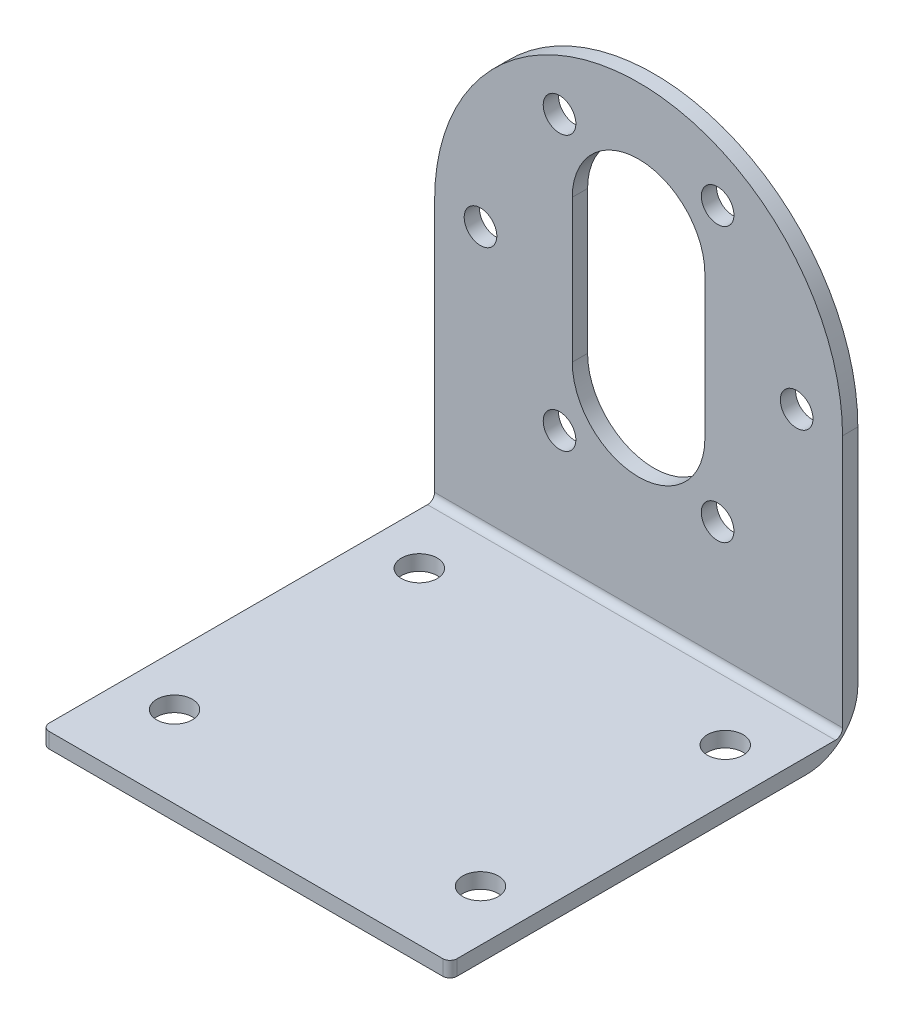
ISO-10303-21;
HEADER;
FILE_DESCRIPTION(('STEP AP214'),'2;1');
FILE_NAME('part.step','',(''),(''),'','','');
FILE_SCHEMA(('AUTOMOTIVE_DESIGN { 1 0 10303 214 1 1 1 1 }'));
ENDSEC;
DATA;
#1=APPLICATION_CONTEXT('core data for automotive mechanical design processes');
#2=APPLICATION_PROTOCOL_DEFINITION('international standard','automotive_design',2000,#1);
#3=PRODUCT_CONTEXT('',#1,'mechanical');
#4=PRODUCT('Part','Part','',(#3));
#5=PRODUCT_RELATED_PRODUCT_CATEGORY('part','',(#4));
#6=PRODUCT_DEFINITION_FORMATION('','',#4);
#7=PRODUCT_DEFINITION_CONTEXT('part definition',#1,'design');
#8=PRODUCT_DEFINITION('design','',#6,#7);
#9=PRODUCT_DEFINITION_SHAPE('','',#8);
#10=(LENGTH_UNIT() NAMED_UNIT(*) SI_UNIT(.MILLI.,.METRE.));
#11=(NAMED_UNIT(*) PLANE_ANGLE_UNIT() SI_UNIT($,.RADIAN.));
#12=(NAMED_UNIT(*) SI_UNIT($,.STERADIAN.) SOLID_ANGLE_UNIT());
#13=UNCERTAINTY_MEASURE_WITH_UNIT(LENGTH_MEASURE(1.E-05),#10,'distance_accuracy_value','');
#14=(GEOMETRIC_REPRESENTATION_CONTEXT(3) GLOBAL_UNCERTAINTY_ASSIGNED_CONTEXT((#13)) GLOBAL_UNIT_ASSIGNED_CONTEXT((#10,
#11,#12)) REPRESENTATION_CONTEXT('',''));
#15=CARTESIAN_POINT('',(0.,0.,0.));
#16=DIRECTION('',(0.,0.,1.));
#17=DIRECTION('',(1.,0.,0.));
#18=AXIS2_PLACEMENT_3D('',#15,#16,#17);
#19=CARTESIAN_POINT('',(40.,5.03672580799631,-40.));
#20=DIRECTION('',(0.,0.,1.));
#21=DIRECTION('',(1.,0.,0.));
#22=AXIS2_PLACEMENT_3D('',#19,#20,#21);
#23=PLANE('',#22);
#24=CARTESIAN_POINT('',(35.5001602165439,27.,-40.));
#25=DIRECTION('',(0.,0.,-1.));
#26=DIRECTION('',(-1.,0.,0.));
#27=AXIS2_PLACEMENT_3D('',#24,#25,#26);
#28=CIRCLE('',#27,1.6);
#29=CARTESIAN_POINT('',(33.9001602165439,27.,-40.));
#30=VERTEX_POINT('',#29);
#31=EDGE_CURVE('E188',#30,#30,#28,.T.);
#32=ORIENTED_EDGE('',*,*,#31,.F.);
#33=EDGE_LOOP('',(#32));
#34=FACE_BOUND('',#33,.T.);
#35=CARTESIAN_POINT('',(27.750080108272,13.5764674897441,-40.));
#36=DIRECTION('',(0.,0.,-1.));
#37=DIRECTION('',(-1.,0.,0.));
#38=AXIS2_PLACEMENT_3D('',#35,#36,#37);
#39=CIRCLE('',#38,1.59999999999999);
#40=CARTESIAN_POINT('',(26.150080108272,13.5764674897441,-40.));
#41=VERTEX_POINT('',#40);
#42=EDGE_CURVE('E590',#41,#41,#39,.T.);
#43=ORIENTED_EDGE('',*,*,#42,.F.);
#44=EDGE_LOOP('',(#43));
#45=FACE_BOUND('',#44,.T.);
#46=CARTESIAN_POINT('',(12.249919891728,13.5764674897441,-40.));
#47=DIRECTION('',(0.,0.,-1.));
#48=DIRECTION('',(-1.,0.,0.));
#49=AXIS2_PLACEMENT_3D('',#46,#47,#48);
#50=CIRCLE('',#49,1.6);
#51=CARTESIAN_POINT('',(10.649919891728,13.5764674897441,-40.));
#52=VERTEX_POINT('',#51);
#53=EDGE_CURVE('E594',#52,#52,#50,.T.);
#54=ORIENTED_EDGE('',*,*,#53,.F.);
#55=EDGE_LOOP('',(#54));
#56=FACE_BOUND('',#55,.T.);
#57=CARTESIAN_POINT('',(27.750080108272,40.4235325102559,-40.));
#58=DIRECTION('',(0.,0.,-1.));
#59=DIRECTION('',(-1.,0.,0.));
#60=AXIS2_PLACEMENT_3D('',#57,#58,#59);
#61=CIRCLE('',#60,1.6);
#62=CARTESIAN_POINT('',(26.150080108272,40.4235325102559,-40.));
#63=VERTEX_POINT('',#62);
#64=EDGE_CURVE('E598',#63,#63,#61,.T.);
#65=ORIENTED_EDGE('',*,*,#64,.F.);
#66=EDGE_LOOP('',(#65));
#67=FACE_BOUND('',#66,.T.);
#68=DIRECTION('',(0.,1.,0.));
#69=VECTOR('',#68,1.);
#70=CARTESIAN_POINT('',(13.5,34.,-40.));
#71=LINE('',#70,#69);
#72=CARTESIAN_POINT('',(13.5,20.,-40.));
#73=VERTEX_POINT('',#72);
#74=CARTESIAN_POINT('',(13.5,34.,-40.));
#75=VERTEX_POINT('',#74);
#76=EDGE_CURVE('E610',#73,#75,#71,.T.);
#77=ORIENTED_EDGE('',*,*,#76,.F.);
#78=CARTESIAN_POINT('',(20.,20.,-40.));
#79=DIRECTION('',(0.,0.,-1.));
#80=DIRECTION('',(1.,0.,0.));
#81=AXIS2_PLACEMENT_3D('',#78,#79,#80);
#82=CIRCLE('',#81,6.5);
#83=CARTESIAN_POINT('',(26.5,20.,-40.));
#84=VERTEX_POINT('',#83);
#85=EDGE_CURVE('E182',#84,#73,#82,.T.);
#86=ORIENTED_EDGE('',*,*,#85,.F.);
#87=DIRECTION('',(0.,-1.,0.));
#88=VECTOR('',#87,1.);
#89=CARTESIAN_POINT('',(26.5,20.,-40.));
#90=LINE('',#89,#88);
#91=CARTESIAN_POINT('',(26.5,34.,-40.));
#92=VERTEX_POINT('',#91);
#93=EDGE_CURVE('E168',#92,#84,#90,.T.);
#94=ORIENTED_EDGE('',*,*,#93,.F.);
#95=CARTESIAN_POINT('',(20.,34.,-40.));
#96=DIRECTION('',(0.,0.,-1.));
#97=DIRECTION('',(1.,0.,0.));
#98=AXIS2_PLACEMENT_3D('',#95,#96,#97);
#99=CIRCLE('',#98,6.5);
#100=EDGE_CURVE('E607',#75,#92,#99,.T.);
#101=ORIENTED_EDGE('',*,*,#100,.F.);
#102=EDGE_LOOP('',(#77,#86,#94,#101));
#103=FACE_BOUND('',#102,.T.);
#104=CARTESIAN_POINT('',(12.249919891728,40.4235325102559,-40.));
#105=DIRECTION('',(0.,0.,-1.));
#106=DIRECTION('',(-1.,0.,0.));
#107=AXIS2_PLACEMENT_3D('',#104,#105,#106);
#108=CIRCLE('',#107,1.6);
#109=CARTESIAN_POINT('',(10.649919891728,40.4235325102559,-40.));
#110=VERTEX_POINT('',#109);
#111=EDGE_CURVE('E578',#110,#110,#108,.T.);
#112=ORIENTED_EDGE('',*,*,#111,.F.);
#113=EDGE_LOOP('',(#112));
#114=FACE_BOUND('',#113,.T.);
#115=CARTESIAN_POINT('',(4.49983978345607,27.,-40.));
#116=DIRECTION('',(0.,0.,-1.));
#117=DIRECTION('',(-1.,0.,0.));
#118=AXIS2_PLACEMENT_3D('',#115,#116,#117);
#119=CIRCLE('',#118,1.6);
#120=CARTESIAN_POINT('',(2.89983978345607,27.,-40.));
#121=VERTEX_POINT('',#120);
#122=EDGE_CURVE('E582',#121,#121,#119,.T.);
#123=ORIENTED_EDGE('',*,*,#122,.F.);
#124=EDGE_LOOP('',(#123));
#125=FACE_BOUND('',#124,.T.);
#126=DIRECTION('',(0.,1.,0.));
#127=VECTOR('',#126,1.);
#128=CARTESIAN_POINT('',(0.,5.03672580799631,-40.));
#129=LINE('',#128,#127);
#130=CARTESIAN_POINT('',(0.,5.03672580799631,-40.));
#131=VERTEX_POINT('',#130);
#132=CARTESIAN_POINT('',(0.,27.,-40.));
#133=VERTEX_POINT('',#132);
#134=EDGE_CURVE('E247',#131,#133,#129,.T.);
#135=ORIENTED_EDGE('',*,*,#134,.T.);
#136=CARTESIAN_POINT('',(20.,27.,-40.));
#137=DIRECTION('',(0.,0.,-1.));
#138=DIRECTION('',(-1.,0.,0.));
#139=AXIS2_PLACEMENT_3D('',#136,#137,#138);
#140=CIRCLE('',#139,20.);
#141=CARTESIAN_POINT('',(40.,27.,-40.));
#142=VERTEX_POINT('',#141);
#143=EDGE_CURVE('E198',#133,#142,#140,.T.);
#144=ORIENTED_EDGE('',*,*,#143,.T.);
#145=DIRECTION('',(0.,1.,0.));
#146=VECTOR('',#145,1.);
#147=CARTESIAN_POINT('',(40.,5.03672580799631,-40.));
#148=LINE('',#147,#146);
#149=CARTESIAN_POINT('',(40.,5.03672580799631,-40.));
#150=VERTEX_POINT('',#149);
#151=EDGE_CURVE('E235',#150,#142,#148,.T.);
#152=ORIENTED_EDGE('',*,*,#151,.F.);
#153=DIRECTION('',(-1.,0.,0.));
#154=VECTOR('',#153,1.);
#155=CARTESIAN_POINT('',(40.,5.03672580799631,-40.));
#156=LINE('',#155,#154);
#157=EDGE_CURVE('E240',#150,#131,#156,.T.);
#158=ORIENTED_EDGE('',*,*,#157,.T.);
#159=EDGE_LOOP('',(#135,#144,#152,#158));
#160=FACE_BOUND('',#159,.T.);
#161=ADVANCED_FACE('F57',(#34,#45,#56,#67,#103,#114,#125,#160),#23,.F.);
#162=CARTESIAN_POINT('',(40.,47.,-38.5));
#163=DIRECTION('',(0.,0.,-1.));
#164=DIRECTION('',(0.,1.,0.));
#165=AXIS2_PLACEMENT_3D('',#162,#163,#164);
#166=PLANE('',#165);
#167=CARTESIAN_POINT('',(35.5001602165439,27.,-38.5));
#168=DIRECTION('',(0.,0.,-1.));
#169=DIRECTION('',(0.,1.,0.));
#170=AXIS2_PLACEMENT_3D('',#167,#168,#169);
#171=CIRCLE('',#170,1.6);
#172=CARTESIAN_POINT('',(35.5001602165439,28.6,-38.5));
#173=VERTEX_POINT('',#172);
#174=EDGE_CURVE('E196',#173,#173,#171,.F.);
#175=ORIENTED_EDGE('',*,*,#174,.F.);
#176=EDGE_LOOP('',(#175));
#177=FACE_BOUND('',#176,.T.);
#178=CARTESIAN_POINT('',(27.750080108272,13.5764674897441,-38.5));
#179=DIRECTION('',(0.,0.,-1.));
#180=DIRECTION('',(0.,1.,0.));
#181=AXIS2_PLACEMENT_3D('',#178,#179,#180);
#182=CIRCLE('',#181,1.59999999999999);
#183=CARTESIAN_POINT('',(27.750080108272,15.176467489744,-38.5));
#184=VERTEX_POINT('',#183);
#185=EDGE_CURVE('E634',#184,#184,#182,.F.);
#186=ORIENTED_EDGE('',*,*,#185,.F.);
#187=EDGE_LOOP('',(#186));
#188=FACE_BOUND('',#187,.T.);
#189=CARTESIAN_POINT('',(12.249919891728,13.5764674897441,-38.5));
#190=DIRECTION('',(0.,0.,-1.));
#191=DIRECTION('',(0.,1.,0.));
#192=AXIS2_PLACEMENT_3D('',#189,#190,#191);
#193=CIRCLE('',#192,1.6);
#194=CARTESIAN_POINT('',(12.249919891728,15.1764674897441,-38.5));
#195=VERTEX_POINT('',#194);
#196=EDGE_CURVE('E628',#195,#195,#193,.F.);
#197=ORIENTED_EDGE('',*,*,#196,.F.);
#198=EDGE_LOOP('',(#197));
#199=FACE_BOUND('',#198,.T.);
#200=CARTESIAN_POINT('',(27.750080108272,40.4235325102559,-38.5));
#201=DIRECTION('',(0.,0.,-1.));
#202=DIRECTION('',(0.,1.,0.));
#203=AXIS2_PLACEMENT_3D('',#200,#201,#202);
#204=CIRCLE('',#203,1.6);
#205=CARTESIAN_POINT('',(27.750080108272,42.0235325102559,-38.5));
#206=VERTEX_POINT('',#205);
#207=EDGE_CURVE('E584',#206,#206,#204,.F.);
#208=ORIENTED_EDGE('',*,*,#207,.F.);
#209=EDGE_LOOP('',(#208));
#210=FACE_BOUND('',#209,.T.);
#211=DIRECTION('',(0.,1.,0.));
#212=VECTOR('',#211,1.);
#213=CARTESIAN_POINT('',(26.5,20.,-38.5));
#214=LINE('',#213,#212);
#215=CARTESIAN_POINT('',(26.5,20.,-38.5));
#216=VERTEX_POINT('',#215);
#217=CARTESIAN_POINT('',(26.5,34.,-38.5));
#218=VERTEX_POINT('',#217);
#219=EDGE_CURVE('E165',#216,#218,#214,.T.);
#220=ORIENTED_EDGE('',*,*,#219,.F.);
#221=CARTESIAN_POINT('',(20.,20.,-38.5));
#222=DIRECTION('',(0.,0.,-1.));
#223=DIRECTION('',(0.,1.,0.));
#224=AXIS2_PLACEMENT_3D('',#221,#222,#223);
#225=CIRCLE('',#224,6.5);
#226=CARTESIAN_POINT('',(13.5,20.,-38.5));
#227=VERTEX_POINT('',#226);
#228=EDGE_CURVE('E175',#227,#216,#225,.F.);
#229=ORIENTED_EDGE('',*,*,#228,.F.);
#230=DIRECTION('',(0.,-1.,0.));
#231=VECTOR('',#230,1.);
#232=CARTESIAN_POINT('',(13.5,34.,-38.5));
#233=LINE('',#232,#231);
#234=CARTESIAN_POINT('',(13.5,34.,-38.5));
#235=VERTEX_POINT('',#234);
#236=EDGE_CURVE('E172',#235,#227,#233,.T.);
#237=ORIENTED_EDGE('',*,*,#236,.F.);
#238=CARTESIAN_POINT('',(20.,34.,-38.5));
#239=DIRECTION('',(0.,0.,-1.));
#240=DIRECTION('',(0.,1.,0.));
#241=AXIS2_PLACEMENT_3D('',#238,#239,#240);
#242=CIRCLE('',#241,6.5);
#243=EDGE_CURVE('E186',#218,#235,#242,.F.);
#244=ORIENTED_EDGE('',*,*,#243,.F.);
#245=EDGE_LOOP('',(#220,#229,#237,#244));
#246=FACE_BOUND('',#245,.T.);
#247=CARTESIAN_POINT('',(12.249919891728,40.4235325102559,-38.5));
#248=DIRECTION('',(0.,0.,-1.));
#249=DIRECTION('',(0.,1.,0.));
#250=AXIS2_PLACEMENT_3D('',#247,#248,#249);
#251=CIRCLE('',#250,1.6);
#252=CARTESIAN_POINT('',(12.249919891728,42.0235325102559,-38.5));
#253=VERTEX_POINT('',#252);
#254=EDGE_CURVE('E581',#253,#253,#251,.F.);
#255=ORIENTED_EDGE('',*,*,#254,.F.);
#256=EDGE_LOOP('',(#255));
#257=FACE_BOUND('',#256,.T.);
#258=CARTESIAN_POINT('',(4.49983978345607,27.,-38.5));
#259=DIRECTION('',(0.,0.,-1.));
#260=DIRECTION('',(0.,1.,0.));
#261=AXIS2_PLACEMENT_3D('',#258,#259,#260);
#262=CIRCLE('',#261,1.6);
#263=CARTESIAN_POINT('',(4.49983978345607,28.6,-38.5));
#264=VERTEX_POINT('',#263);
#265=EDGE_CURVE('E587',#264,#264,#262,.F.);
#266=ORIENTED_EDGE('',*,*,#265,.F.);
#267=EDGE_LOOP('',(#266));
#268=FACE_BOUND('',#267,.T.);
#269=DIRECTION('',(0.,-1.,0.));
#270=VECTOR('',#269,1.);
#271=CARTESIAN_POINT('',(0.,47.,-38.5));
#272=LINE('',#271,#270);
#273=CARTESIAN_POINT('',(0.,27.,-38.5));
#274=VERTEX_POINT('',#273);
#275=CARTESIAN_POINT('',(0.,2.20000000000001,-38.5));
#276=VERTEX_POINT('',#275);
#277=EDGE_CURVE('E231',#274,#276,#272,.T.);
#278=ORIENTED_EDGE('',*,*,#277,.T.);
#279=DIRECTION('',(-1.,0.,0.));
#280=VECTOR('',#279,1.);
#281=CARTESIAN_POINT('',(40.,2.20000000000001,-38.5));
#282=LINE('',#281,#280);
#283=CARTESIAN_POINT('',(40.,2.20000000000001,-38.5));
#284=VERTEX_POINT('',#283);
#285=EDGE_CURVE('E72',#276,#284,#282,.F.);
#286=ORIENTED_EDGE('',*,*,#285,.T.);
#287=DIRECTION('',(0.,-1.,0.));
#288=VECTOR('',#287,1.);
#289=CARTESIAN_POINT('',(40.,47.,-38.5));
#290=LINE('',#289,#288);
#291=CARTESIAN_POINT('',(40.,27.,-38.5));
#292=VERTEX_POINT('',#291);
#293=EDGE_CURVE('E238',#292,#284,#290,.T.);
#294=ORIENTED_EDGE('',*,*,#293,.F.);
#295=CARTESIAN_POINT('',(20.,27.,-38.5));
#296=DIRECTION('',(0.,0.,-1.));
#297=DIRECTION('',(0.,1.,0.));
#298=AXIS2_PLACEMENT_3D('',#295,#296,#297);
#299=CIRCLE('',#298,20.);
#300=EDGE_CURVE('E195',#292,#274,#299,.F.);
#301=ORIENTED_EDGE('',*,*,#300,.T.);
#302=EDGE_LOOP('',(#278,#286,#294,#301));
#303=FACE_BOUND('',#302,.T.);
#304=ADVANCED_FACE('F184',(#177,#188,#199,#210,#246,#257,#268,#303),#166,.F.);
#305=CARTESIAN_POINT('',(40.,1.50000000000001,-38.5));
#306=DIRECTION('',(0.,-1.,0.));
#307=DIRECTION('',(0.,0.,-1.));
#308=AXIS2_PLACEMENT_3D('',#305,#306,#307);
#309=PLANE('',#308);
#310=CARTESIAN_POINT('',(5.,1.50000000000001,-32.));
#311=DIRECTION('',(0.,-1.,0.));
#312=DIRECTION('',(0.,0.,-1.));
#313=AXIS2_PLACEMENT_3D('',#310,#311,#312);
#314=CIRCLE('',#313,1.75);
#315=CARTESIAN_POINT('',(5.,1.50000000000001,-33.75));
#316=VERTEX_POINT('',#315);
#317=EDGE_CURVE('E203',#316,#316,#314,.F.);
#318=ORIENTED_EDGE('',*,*,#317,.F.);
#319=EDGE_LOOP('',(#318));
#320=FACE_BOUND('',#319,.T.);
#321=CARTESIAN_POINT('',(35.,1.50000000000001,-32.));
#322=DIRECTION('',(0.,-1.,0.));
#323=DIRECTION('',(0.,0.,-1.));
#324=AXIS2_PLACEMENT_3D('',#321,#322,#323);
#325=CIRCLE('',#324,1.75);
#326=CARTESIAN_POINT('',(35.,1.50000000000001,-33.75));
#327=VERTEX_POINT('',#326);
#328=EDGE_CURVE('E212',#327,#327,#325,.F.);
#329=ORIENTED_EDGE('',*,*,#328,.F.);
#330=EDGE_LOOP('',(#329));
#331=FACE_BOUND('',#330,.T.);
#332=CARTESIAN_POINT('',(35.,1.5,-8.));
#333=DIRECTION('',(0.,-1.,0.));
#334=DIRECTION('',(0.,0.,-1.));
#335=AXIS2_PLACEMENT_3D('',#332,#333,#334);
#336=CIRCLE('',#335,1.75);
#337=CARTESIAN_POINT('',(35.,1.5,-9.75));
#338=VERTEX_POINT('',#337);
#339=EDGE_CURVE('E204',#338,#338,#336,.F.);
#340=ORIENTED_EDGE('',*,*,#339,.F.);
#341=EDGE_LOOP('',(#340));
#342=FACE_BOUND('',#341,.T.);
#343=CARTESIAN_POINT('',(5.,1.5,-8.));
#344=DIRECTION('',(0.,-1.,0.));
#345=DIRECTION('',(0.,0.,-1.));
#346=AXIS2_PLACEMENT_3D('',#343,#344,#345);
#347=CIRCLE('',#346,1.75);
#348=CARTESIAN_POINT('',(5.,1.5,-9.75));
#349=VERTEX_POINT('',#348);
#350=EDGE_CURVE('E224',#349,#349,#347,.F.);
#351=ORIENTED_EDGE('',*,*,#350,.F.);
#352=EDGE_LOOP('',(#351));
#353=FACE_BOUND('',#352,.T.);
#354=DIRECTION('',(0.,0.,1.));
#355=VECTOR('',#354,1.);
#356=CARTESIAN_POINT('',(0.,1.50000000000001,-38.5));
#357=LINE('',#356,#355);
#358=CARTESIAN_POINT('',(0.,1.50000000000001,-37.8));
#359=VERTEX_POINT('',#358);
#360=CARTESIAN_POINT('',(0.,1.5,-0.699999999999999));
#361=VERTEX_POINT('',#360);
#362=EDGE_CURVE('E227',#359,#361,#357,.T.);
#363=ORIENTED_EDGE('',*,*,#362,.T.);
#364=CARTESIAN_POINT('',(0.699999999999999,1.5,-0.699999999999999));
#365=DIRECTION('',(0.,-1.,0.));
#366=DIRECTION('',(0.,0.,-1.));
#367=AXIS2_PLACEMENT_3D('',#364,#365,#366);
#368=CIRCLE('',#367,0.699999999999999);
#369=CARTESIAN_POINT('',(0.699999999999999,1.5,0.));
#370=VERTEX_POINT('',#369);
#371=EDGE_CURVE('E277',#361,#370,#368,.F.);
#372=ORIENTED_EDGE('',*,*,#371,.T.);
#373=DIRECTION('',(-1.,0.,0.));
#374=VECTOR('',#373,1.);
#375=CARTESIAN_POINT('',(40.,1.5,0.));
#376=LINE('',#375,#374);
#377=CARTESIAN_POINT('',(39.3,1.5,0.));
#378=VERTEX_POINT('',#377);
#379=EDGE_CURVE('E259',#378,#370,#376,.T.);
#380=ORIENTED_EDGE('',*,*,#379,.F.);
#381=CARTESIAN_POINT('',(39.3,1.5,-0.699999999999999));
#382=DIRECTION('',(0.,-1.,0.));
#383=DIRECTION('',(0.,0.,-1.));
#384=AXIS2_PLACEMENT_3D('',#381,#382,#383);
#385=CIRCLE('',#384,0.699999999999999);
#386=CARTESIAN_POINT('',(40.,1.5,-0.699999999999999));
#387=VERTEX_POINT('',#386);
#388=EDGE_CURVE('E80',#378,#387,#385,.F.);
#389=ORIENTED_EDGE('',*,*,#388,.T.);
#390=DIRECTION('',(0.,0.,1.));
#391=VECTOR('',#390,1.);
#392=CARTESIAN_POINT('',(40.,1.50000000000001,-38.5));
#393=LINE('',#392,#391);
#394=CARTESIAN_POINT('',(40.,1.50000000000001,-37.8));
#395=VERTEX_POINT('',#394);
#396=EDGE_CURVE('E228',#395,#387,#393,.T.);
#397=ORIENTED_EDGE('',*,*,#396,.F.);
#398=DIRECTION('',(-1.,0.,0.));
#399=VECTOR('',#398,1.);
#400=CARTESIAN_POINT('',(0.,1.50000000000001,-37.8));
#401=LINE('',#400,#399);
#402=EDGE_CURVE('E273',#395,#359,#401,.T.);
#403=ORIENTED_EDGE('',*,*,#402,.T.);
#404=EDGE_LOOP('',(#363,#372,#380,#389,#397,#403));
#405=FACE_BOUND('',#404,.T.);
#406=ADVANCED_FACE('F295',(#320,#331,#342,#353,#405),#309,.F.);
#407=CARTESIAN_POINT('',(40.,1.5,0.));
#408=DIRECTION('',(0.,0.,-1.));
#409=DIRECTION('',(0.,1.,0.));
#410=AXIS2_PLACEMENT_3D('',#407,#408,#409);
#411=PLANE('',#410);
#412=ORIENTED_EDGE('',*,*,#379,.T.);
#413=DIRECTION('',(0.,-1.,0.));
#414=VECTOR('',#413,1.);
#415=CARTESIAN_POINT('',(0.699999999999999,1.5,0.));
#416=LINE('',#415,#414);
#417=CARTESIAN_POINT('',(0.699999999999999,0.,0.));
#418=VERTEX_POINT('',#417);
#419=EDGE_CURVE('E264',#370,#418,#416,.T.);
#420=ORIENTED_EDGE('',*,*,#419,.T.);
#421=DIRECTION('',(-1.,0.,0.));
#422=VECTOR('',#421,1.);
#423=CARTESIAN_POINT('',(40.,0.,0.));
#424=LINE('',#423,#422);
#425=CARTESIAN_POINT('',(39.3,0.,0.));
#426=VERTEX_POINT('',#425);
#427=EDGE_CURVE('E256',#426,#418,#424,.T.);
#428=ORIENTED_EDGE('',*,*,#427,.F.);
#429=DIRECTION('',(0.,-1.,0.));
#430=VECTOR('',#429,1.);
#431=CARTESIAN_POINT('',(39.3,1.5,0.));
#432=LINE('',#431,#430);
#433=EDGE_CURVE('E262',#426,#378,#432,.F.);
#434=ORIENTED_EDGE('',*,*,#433,.T.);
#435=EDGE_LOOP('',(#412,#420,#428,#434));
#436=FACE_BOUND('',#435,.T.);
#437=ADVANCED_FACE('F303',(#436),#411,.F.);
#438=CARTESIAN_POINT('',(40.,0.,0.));
#439=DIRECTION('',(0.,1.,0.));
#440=DIRECTION('',(0.,0.,1.));
#441=AXIS2_PLACEMENT_3D('',#438,#439,#440);
#442=PLANE('',#441);
#443=CARTESIAN_POINT('',(5.,0.,-32.));
#444=DIRECTION('',(0.,-1.,0.));
#445=DIRECTION('',(0.,0.,-1.));
#446=AXIS2_PLACEMENT_3D('',#443,#444,#445);
#447=CIRCLE('',#446,1.75);
#448=CARTESIAN_POINT('',(5.,0.,-33.75));
#449=VERTEX_POINT('',#448);
#450=EDGE_CURVE('E215',#449,#449,#447,.T.);
#451=ORIENTED_EDGE('',*,*,#450,.F.);
#452=EDGE_LOOP('',(#451));
#453=FACE_BOUND('',#452,.T.);
#454=CARTESIAN_POINT('',(35.,0.,-32.));
#455=DIRECTION('',(0.,-1.,0.));
#456=DIRECTION('',(0.,0.,-1.));
#457=AXIS2_PLACEMENT_3D('',#454,#455,#456);
#458=CIRCLE('',#457,1.75);
#459=CARTESIAN_POINT('',(35.,0.,-33.75));
#460=VERTEX_POINT('',#459);
#461=EDGE_CURVE('E208',#460,#460,#458,.T.);
#462=ORIENTED_EDGE('',*,*,#461,.F.);
#463=EDGE_LOOP('',(#462));
#464=FACE_BOUND('',#463,.T.);
#465=CARTESIAN_POINT('',(35.,0.,-8.));
#466=DIRECTION('',(0.,-1.,0.));
#467=DIRECTION('',(0.,0.,-1.));
#468=AXIS2_PLACEMENT_3D('',#465,#466,#467);
#469=CIRCLE('',#468,1.75);
#470=CARTESIAN_POINT('',(35.,0.,-9.75));
#471=VERTEX_POINT('',#470);
#472=EDGE_CURVE('E207',#471,#471,#469,.T.);
#473=ORIENTED_EDGE('',*,*,#472,.F.);
#474=EDGE_LOOP('',(#473));
#475=FACE_BOUND('',#474,.T.);
#476=CARTESIAN_POINT('',(5.,0.,-8.));
#477=DIRECTION('',(0.,-1.,0.));
#478=DIRECTION('',(0.,0.,-1.));
#479=AXIS2_PLACEMENT_3D('',#476,#477,#478);
#480=CIRCLE('',#479,1.75);
#481=CARTESIAN_POINT('',(5.,0.,-9.75));
#482=VERTEX_POINT('',#481);
#483=EDGE_CURVE('E211',#482,#482,#480,.T.);
#484=ORIENTED_EDGE('',*,*,#483,.F.);
#485=EDGE_LOOP('',(#484));
#486=FACE_BOUND('',#485,.T.);
#487=ORIENTED_EDGE('',*,*,#427,.T.);
#488=CARTESIAN_POINT('',(0.699999999999999,0.,-0.699999999999999));
#489=DIRECTION('',(0.,1.,0.));
#490=DIRECTION('',(0.,0.,1.));
#491=AXIS2_PLACEMENT_3D('',#488,#489,#490);
#492=CIRCLE('',#491,0.699999999999999);
#493=CARTESIAN_POINT('',(0.,0.,-0.699999999999999));
#494=VERTEX_POINT('',#493);
#495=EDGE_CURVE('E269',#418,#494,#492,.F.);
#496=ORIENTED_EDGE('',*,*,#495,.T.);
#497=DIRECTION('',(0.,0.,-1.));
#498=VECTOR('',#497,1.);
#499=CARTESIAN_POINT('',(0.,0.,0.));
#500=LINE('',#499,#498);
#501=CARTESIAN_POINT('',(0.,0.,-34.9632741920037));
#502=VERTEX_POINT('',#501);
#503=EDGE_CURVE('E243',#494,#502,#500,.T.);
#504=ORIENTED_EDGE('',*,*,#503,.T.);
#505=DIRECTION('',(-1.,0.,0.));
#506=VECTOR('',#505,1.);
#507=CARTESIAN_POINT('',(40.,0.,-34.9632741920037));
#508=LINE('',#507,#506);
#509=CARTESIAN_POINT('',(40.,0.,-34.9632741920037));
#510=VERTEX_POINT('',#509);
#511=EDGE_CURVE('E253',#510,#502,#508,.T.);
#512=ORIENTED_EDGE('',*,*,#511,.F.);
#513=DIRECTION('',(0.,0.,-1.));
#514=VECTOR('',#513,1.);
#515=CARTESIAN_POINT('',(40.,0.,0.));
#516=LINE('',#515,#514);
#517=CARTESIAN_POINT('',(40.,0.,-0.699999999999999));
#518=VERTEX_POINT('',#517);
#519=EDGE_CURVE('E230',#518,#510,#516,.T.);
#520=ORIENTED_EDGE('',*,*,#519,.F.);
#521=CARTESIAN_POINT('',(39.3,0.,-0.699999999999999));
#522=DIRECTION('',(0.,1.,0.));
#523=DIRECTION('',(0.,0.,1.));
#524=AXIS2_PLACEMENT_3D('',#521,#522,#523);
#525=CIRCLE('',#524,0.699999999999999);
#526=EDGE_CURVE('E267',#518,#426,#525,.F.);
#527=ORIENTED_EDGE('',*,*,#526,.T.);
#528=EDGE_LOOP('',(#487,#496,#504,#512,#520,#527));
#529=FACE_BOUND('',#528,.T.);
#530=ADVANCED_FACE('F306',(#453,#464,#475,#486,#529),#442,.F.);
#531=CARTESIAN_POINT('',(40.,5.03672580799631,-34.9632741920037));
#532=DIRECTION('',(-1.,0.,0.));
#533=DIRECTION('',(0.,0.,1.));
#534=AXIS2_PLACEMENT_3D('',#531,#532,#533);
#535=CYLINDRICAL_SURFACE('',#534,5.03672580799631);
#536=CARTESIAN_POINT('',(0.,5.03672580799631,-34.9632741920037));
#537=DIRECTION('',(1.,0.,0.));
#538=DIRECTION('',(0.,0.,-1.));
#539=AXIS2_PLACEMENT_3D('',#536,#537,#538);
#540=CIRCLE('',#539,5.03672580799631);
#541=EDGE_CURVE('E245',#502,#131,#540,.T.);
#542=ORIENTED_EDGE('',*,*,#541,.T.);
#543=ORIENTED_EDGE('',*,*,#157,.F.);
#544=CARTESIAN_POINT('',(40.,5.03672580799631,-34.9632741920037));
#545=DIRECTION('',(1.,0.,0.));
#546=DIRECTION('',(0.,0.,-1.));
#547=AXIS2_PLACEMENT_3D('',#544,#545,#546);
#548=CIRCLE('',#547,5.03672580799631);
#549=EDGE_CURVE('E233',#510,#150,#548,.T.);
#550=ORIENTED_EDGE('',*,*,#549,.F.);
#551=ORIENTED_EDGE('',*,*,#511,.T.);
#552=EDGE_LOOP('',(#542,#543,#550,#551));
#553=FACE_BOUND('',#552,.T.);
#554=ADVANCED_FACE('F315',(#553),#535,.T.);
#555=CARTESIAN_POINT('',(40.,5.03672580799631,-34.9632741920037));
#556=DIRECTION('',(1.,0.,0.));
#557=DIRECTION('',(0.,0.,-1.));
#558=AXIS2_PLACEMENT_3D('',#555,#556,#557);
#559=PLANE('',#558);
#560=ORIENTED_EDGE('',*,*,#396,.T.);
#561=DIRECTION('',(0.,-1.,0.));
#562=VECTOR('',#561,1.);
#563=CARTESIAN_POINT('',(40.,0.,-0.699999999999999));
#564=LINE('',#563,#562);
#565=EDGE_CURVE('E279',#387,#518,#564,.T.);
#566=ORIENTED_EDGE('',*,*,#565,.T.);
#567=ORIENTED_EDGE('',*,*,#519,.T.);
#568=ORIENTED_EDGE('',*,*,#549,.T.);
#569=ORIENTED_EDGE('',*,*,#151,.T.);
#570=DIRECTION('',(0.,0.,-1.));
#571=VECTOR('',#570,1.);
#572=CARTESIAN_POINT('',(40.,27.,0.001000000000001));
#573=LINE('',#572,#571);
#574=EDGE_CURVE('E201',#292,#142,#573,.T.);
#575=ORIENTED_EDGE('',*,*,#574,.F.);
#576=ORIENTED_EDGE('',*,*,#293,.T.);
#577=CARTESIAN_POINT('',(40.,2.20000000000001,-37.8));
#578=DIRECTION('',(1.,0.,0.));
#579=DIRECTION('',(0.,0.,-1.));
#580=AXIS2_PLACEMENT_3D('',#577,#578,#579);
#581=CIRCLE('',#580,0.699999999999999);
#582=EDGE_CURVE('E12',#284,#395,#581,.F.);
#583=ORIENTED_EDGE('',*,*,#582,.T.);
#584=EDGE_LOOP('',(#560,#566,#567,#568,#569,#575,#576,#583));
#585=FACE_BOUND('',#584,.T.);
#586=ADVANCED_FACE('F292',(#585),#559,.T.);
#587=CARTESIAN_POINT('',(0.,5.03672580799631,-34.9632741920037));
#588=DIRECTION('',(1.,0.,0.));
#589=DIRECTION('',(0.,0.,-1.));
#590=AXIS2_PLACEMENT_3D('',#587,#588,#589);
#591=PLANE('',#590);
#592=ORIENTED_EDGE('',*,*,#503,.F.);
#593=DIRECTION('',(0.,-1.,0.));
#594=VECTOR('',#593,1.);
#595=CARTESIAN_POINT('',(0.,5.03672580799631,-0.699999999999999));
#596=LINE('',#595,#594);
#597=EDGE_CURVE('E271',#494,#361,#596,.F.);
#598=ORIENTED_EDGE('',*,*,#597,.T.);
#599=ORIENTED_EDGE('',*,*,#362,.F.);
#600=CARTESIAN_POINT('',(0.,2.20000000000001,-37.8));
#601=DIRECTION('',(1.,0.,0.));
#602=DIRECTION('',(0.,0.,-1.));
#603=AXIS2_PLACEMENT_3D('',#600,#601,#602);
#604=CIRCLE('',#603,0.699999999999999);
#605=EDGE_CURVE('E65',#359,#276,#604,.T.);
#606=ORIENTED_EDGE('',*,*,#605,.T.);
#607=ORIENTED_EDGE('',*,*,#277,.F.);
#608=DIRECTION('',(0.,0.,-1.));
#609=VECTOR('',#608,1.);
#610=CARTESIAN_POINT('',(0.,27.,0.001000000000001));
#611=LINE('',#610,#609);
#612=EDGE_CURVE('E192',#274,#133,#611,.T.);
#613=ORIENTED_EDGE('',*,*,#612,.T.);
#614=ORIENTED_EDGE('',*,*,#134,.F.);
#615=ORIENTED_EDGE('',*,*,#541,.F.);
#616=EDGE_LOOP('',(#592,#598,#599,#606,#607,#613,#614,#615));
#617=FACE_BOUND('',#616,.T.);
#618=ADVANCED_FACE('F286',(#617),#591,.F.);
#619=CARTESIAN_POINT('',(5.,47.001,-8.));
#620=DIRECTION('',(0.,-1.,0.));
#621=DIRECTION('',(0.,0.,-1.));
#622=AXIS2_PLACEMENT_3D('',#619,#620,#621);
#623=CYLINDRICAL_SURFACE('',#622,1.75);
#624=ORIENTED_EDGE('',*,*,#483,.T.);
#625=EDGE_LOOP('',(#624));
#626=FACE_BOUND('',#625,.T.);
#627=ORIENTED_EDGE('',*,*,#350,.T.);
#628=EDGE_LOOP('',(#627));
#629=FACE_BOUND('',#628,.T.);
#630=ADVANCED_FACE('F510',(#626,#629),#623,.F.);
#631=CARTESIAN_POINT('',(35.,47.001,-8.));
#632=DIRECTION('',(0.,-1.,0.));
#633=DIRECTION('',(0.,0.,-1.));
#634=AXIS2_PLACEMENT_3D('',#631,#632,#633);
#635=CYLINDRICAL_SURFACE('',#634,1.75);
#636=ORIENTED_EDGE('',*,*,#472,.T.);
#637=EDGE_LOOP('',(#636));
#638=FACE_BOUND('',#637,.T.);
#639=ORIENTED_EDGE('',*,*,#339,.T.);
#640=EDGE_LOOP('',(#639));
#641=FACE_BOUND('',#640,.T.);
#642=ADVANCED_FACE('F500',(#638,#641),#635,.F.);
#643=CARTESIAN_POINT('',(35.,47.001,-32.));
#644=DIRECTION('',(0.,-1.,0.));
#645=DIRECTION('',(0.,0.,-1.));
#646=AXIS2_PLACEMENT_3D('',#643,#644,#645);
#647=CYLINDRICAL_SURFACE('',#646,1.75);
#648=ORIENTED_EDGE('',*,*,#461,.T.);
#649=EDGE_LOOP('',(#648));
#650=FACE_BOUND('',#649,.T.);
#651=ORIENTED_EDGE('',*,*,#328,.T.);
#652=EDGE_LOOP('',(#651));
#653=FACE_BOUND('',#652,.T.);
#654=ADVANCED_FACE('F333',(#650,#653),#647,.F.);
#655=CARTESIAN_POINT('',(5.,47.001,-32.));
#656=DIRECTION('',(0.,-1.,0.));
#657=DIRECTION('',(0.,0.,-1.));
#658=AXIS2_PLACEMENT_3D('',#655,#656,#657);
#659=CYLINDRICAL_SURFACE('',#658,1.75);
#660=ORIENTED_EDGE('',*,*,#450,.T.);
#661=EDGE_LOOP('',(#660));
#662=FACE_BOUND('',#661,.T.);
#663=ORIENTED_EDGE('',*,*,#317,.T.);
#664=EDGE_LOOP('',(#663));
#665=FACE_BOUND('',#664,.T.);
#666=ADVANCED_FACE('F323',(#662,#665),#659,.F.);
#667=CARTESIAN_POINT('',(20.,27.,0.001000000000001));
#668=DIRECTION('',(0.,0.,-1.));
#669=DIRECTION('',(-1.,0.,0.));
#670=AXIS2_PLACEMENT_3D('',#667,#668,#669);
#671=CYLINDRICAL_SURFACE('',#670,20.);
#672=ORIENTED_EDGE('',*,*,#574,.T.);
#673=ORIENTED_EDGE('',*,*,#143,.F.);
#674=ORIENTED_EDGE('',*,*,#612,.F.);
#675=ORIENTED_EDGE('',*,*,#300,.F.);
#676=EDGE_LOOP('',(#672,#673,#674,#675));
#677=FACE_BOUND('',#676,.T.);
#678=ADVANCED_FACE('F320',(#677),#671,.T.);
#679=CARTESIAN_POINT('',(4.49983978345607,27.,0.001000000000001));
#680=DIRECTION('',(0.,0.,-1.));
#681=DIRECTION('',(-1.,0.,0.));
#682=AXIS2_PLACEMENT_3D('',#679,#680,#681);
#683=CYLINDRICAL_SURFACE('',#682,1.6);
#684=ORIENTED_EDGE('',*,*,#122,.T.);
#685=EDGE_LOOP('',(#684));
#686=FACE_BOUND('',#685,.T.);
#687=ORIENTED_EDGE('',*,*,#265,.T.);
#688=EDGE_LOOP('',(#687));
#689=FACE_BOUND('',#688,.T.);
#690=ADVANCED_FACE('F322',(#686,#689),#683,.F.);
#691=CARTESIAN_POINT('',(12.249919891728,40.4235325102559,0.001000000000001));
#692=DIRECTION('',(0.,0.,-1.));
#693=DIRECTION('',(-1.,0.,0.));
#694=AXIS2_PLACEMENT_3D('',#691,#692,#693);
#695=CYLINDRICAL_SURFACE('',#694,1.6);
#696=ORIENTED_EDGE('',*,*,#111,.T.);
#697=EDGE_LOOP('',(#696));
#698=FACE_BOUND('',#697,.T.);
#699=ORIENTED_EDGE('',*,*,#254,.T.);
#700=EDGE_LOOP('',(#699));
#701=FACE_BOUND('',#700,.T.);
#702=ADVANCED_FACE('F330',(#698,#701),#695,.F.);
#703=CARTESIAN_POINT('',(20.,20.,0.001000000000001));
#704=DIRECTION('',(0.,0.,-1.));
#705=DIRECTION('',(-1.,0.,0.));
#706=AXIS2_PLACEMENT_3D('',#703,#704,#705);
#707=CYLINDRICAL_SURFACE('',#706,6.5);
#708=ORIENTED_EDGE('',*,*,#228,.T.);
#709=DIRECTION('',(0.,0.,-1.));
#710=VECTOR('',#709,1.);
#711=CARTESIAN_POINT('',(26.5,20.,0.001000000000001));
#712=LINE('',#711,#710);
#713=EDGE_CURVE('E161',#216,#84,#712,.T.);
#714=ORIENTED_EDGE('',*,*,#713,.T.);
#715=ORIENTED_EDGE('',*,*,#85,.T.);
#716=DIRECTION('',(0.,0.,-1.));
#717=VECTOR('',#716,1.);
#718=CARTESIAN_POINT('',(13.5,20.,0.001000000000001));
#719=LINE('',#718,#717);
#720=EDGE_CURVE('E178',#227,#73,#719,.T.);
#721=ORIENTED_EDGE('',*,*,#720,.F.);
#722=EDGE_LOOP('',(#708,#714,#715,#721));
#723=FACE_BOUND('',#722,.T.);
#724=ADVANCED_FACE('F176',(#723),#707,.F.);
#725=CARTESIAN_POINT('',(26.5,20.,0.001000000000001));
#726=DIRECTION('',(1.,0.,0.));
#727=DIRECTION('',(0.,0.,-1.));
#728=AXIS2_PLACEMENT_3D('',#725,#726,#727);
#729=PLANE('',#728);
#730=ORIENTED_EDGE('',*,*,#219,.T.);
#731=DIRECTION('',(0.,0.,-1.));
#732=VECTOR('',#731,1.);
#733=CARTESIAN_POINT('',(26.5,34.,0.001000000000001));
#734=LINE('',#733,#732);
#735=EDGE_CURVE('E171',#218,#92,#734,.T.);
#736=ORIENTED_EDGE('',*,*,#735,.T.);
#737=ORIENTED_EDGE('',*,*,#93,.T.);
#738=ORIENTED_EDGE('',*,*,#713,.F.);
#739=EDGE_LOOP('',(#730,#736,#737,#738));
#740=FACE_BOUND('',#739,.T.);
#741=ADVANCED_FACE('F163',(#740),#729,.F.);
#742=CARTESIAN_POINT('',(20.,34.,0.001000000000001));
#743=DIRECTION('',(0.,0.,-1.));
#744=DIRECTION('',(-1.,0.,0.));
#745=AXIS2_PLACEMENT_3D('',#742,#743,#744);
#746=CYLINDRICAL_SURFACE('',#745,6.5);
#747=ORIENTED_EDGE('',*,*,#243,.T.);
#748=DIRECTION('',(0.,0.,-1.));
#749=VECTOR('',#748,1.);
#750=CARTESIAN_POINT('',(13.5,34.,0.001000000000001));
#751=LINE('',#750,#749);
#752=EDGE_CURVE('E603',#235,#75,#751,.T.);
#753=ORIENTED_EDGE('',*,*,#752,.T.);
#754=ORIENTED_EDGE('',*,*,#100,.T.);
#755=ORIENTED_EDGE('',*,*,#735,.F.);
#756=EDGE_LOOP('',(#747,#753,#754,#755));
#757=FACE_BOUND('',#756,.T.);
#758=ADVANCED_FACE('F428',(#757),#746,.F.);
#759=CARTESIAN_POINT('',(13.5,34.,0.001000000000001));
#760=DIRECTION('',(-1.,0.,0.));
#761=DIRECTION('',(0.,-1.,0.));
#762=AXIS2_PLACEMENT_3D('',#759,#760,#761);
#763=PLANE('',#762);
#764=ORIENTED_EDGE('',*,*,#236,.T.);
#765=ORIENTED_EDGE('',*,*,#720,.T.);
#766=ORIENTED_EDGE('',*,*,#76,.T.);
#767=ORIENTED_EDGE('',*,*,#752,.F.);
#768=EDGE_LOOP('',(#764,#765,#766,#767));
#769=FACE_BOUND('',#768,.T.);
#770=ADVANCED_FACE('F418',(#769),#763,.F.);
#771=CARTESIAN_POINT('',(27.750080108272,40.4235325102559,0.001000000000001));
#772=DIRECTION('',(0.,0.,-1.));
#773=DIRECTION('',(-1.,0.,0.));
#774=AXIS2_PLACEMENT_3D('',#771,#772,#773);
#775=CYLINDRICAL_SURFACE('',#774,1.6);
#776=ORIENTED_EDGE('',*,*,#64,.T.);
#777=EDGE_LOOP('',(#776));
#778=FACE_BOUND('',#777,.T.);
#779=ORIENTED_EDGE('',*,*,#207,.T.);
#780=EDGE_LOOP('',(#779));
#781=FACE_BOUND('',#780,.T.);
#782=ADVANCED_FACE('F408',(#778,#781),#775,.F.);
#783=CARTESIAN_POINT('',(12.249919891728,13.5764674897441,0.001000000000001));
#784=DIRECTION('',(0.,0.,-1.));
#785=DIRECTION('',(-1.,0.,0.));
#786=AXIS2_PLACEMENT_3D('',#783,#784,#785);
#787=CYLINDRICAL_SURFACE('',#786,1.6);
#788=ORIENTED_EDGE('',*,*,#53,.T.);
#789=EDGE_LOOP('',(#788));
#790=FACE_BOUND('',#789,.T.);
#791=ORIENTED_EDGE('',*,*,#196,.T.);
#792=EDGE_LOOP('',(#791));
#793=FACE_BOUND('',#792,.T.);
#794=ADVANCED_FACE('F398',(#790,#793),#787,.F.);
#795=CARTESIAN_POINT('',(27.750080108272,13.5764674897441,0.001000000000001));
#796=DIRECTION('',(0.,0.,-1.));
#797=DIRECTION('',(-1.,0.,0.));
#798=AXIS2_PLACEMENT_3D('',#795,#796,#797);
#799=CYLINDRICAL_SURFACE('',#798,1.59999999999999);
#800=ORIENTED_EDGE('',*,*,#42,.T.);
#801=EDGE_LOOP('',(#800));
#802=FACE_BOUND('',#801,.T.);
#803=ORIENTED_EDGE('',*,*,#185,.T.);
#804=EDGE_LOOP('',(#803));
#805=FACE_BOUND('',#804,.T.);
#806=ADVANCED_FACE('F388',(#802,#805),#799,.F.);
#807=CARTESIAN_POINT('',(35.5001602165439,27.,0.001000000000001));
#808=DIRECTION('',(0.,0.,-1.));
#809=DIRECTION('',(-1.,0.,0.));
#810=AXIS2_PLACEMENT_3D('',#807,#808,#809);
#811=CYLINDRICAL_SURFACE('',#810,1.6);
#812=ORIENTED_EDGE('',*,*,#31,.T.);
#813=EDGE_LOOP('',(#812));
#814=FACE_BOUND('',#813,.T.);
#815=ORIENTED_EDGE('',*,*,#174,.T.);
#816=EDGE_LOOP('',(#815));
#817=FACE_BOUND('',#816,.T.);
#818=ADVANCED_FACE('F360',(#814,#817),#811,.F.);
#819=CARTESIAN_POINT('',(0.699999999999999,1.5,-0.699999999999999));
#820=DIRECTION('',(0.,-1.,0.));
#821=DIRECTION('',(0.,0.,-1.));
#822=AXIS2_PLACEMENT_3D('',#819,#820,#821);
#823=CYLINDRICAL_SURFACE('',#822,0.699999999999999);
#824=ORIENTED_EDGE('',*,*,#371,.F.);
#825=ORIENTED_EDGE('',*,*,#597,.F.);
#826=ORIENTED_EDGE('',*,*,#495,.F.);
#827=ORIENTED_EDGE('',*,*,#419,.F.);
#828=EDGE_LOOP('',(#824,#825,#826,#827));
#829=FACE_BOUND('',#828,.T.);
#830=ADVANCED_FACE('F300',(#829),#823,.T.);
#831=CARTESIAN_POINT('',(39.3,5.03672580799631,-0.699999999999999));
#832=DIRECTION('',(0.,1.,0.));
#833=DIRECTION('',(0.,0.,1.));
#834=AXIS2_PLACEMENT_3D('',#831,#832,#833);
#835=CYLINDRICAL_SURFACE('',#834,0.699999999999999);
#836=ORIENTED_EDGE('',*,*,#388,.F.);
#837=ORIENTED_EDGE('',*,*,#433,.F.);
#838=ORIENTED_EDGE('',*,*,#526,.F.);
#839=ORIENTED_EDGE('',*,*,#565,.F.);
#840=EDGE_LOOP('',(#836,#837,#838,#839));
#841=FACE_BOUND('',#840,.T.);
#842=ADVANCED_FACE('F310',(#841),#835,.T.);
#843=CARTESIAN_POINT('',(40.,2.20000000000001,-37.8));
#844=DIRECTION('',(1.,0.,0.));
#845=DIRECTION('',(0.,0.,-1.));
#846=AXIS2_PLACEMENT_3D('',#843,#844,#845);
#847=CYLINDRICAL_SURFACE('',#846,0.699999999999999);
#848=ORIENTED_EDGE('',*,*,#582,.F.);
#849=ORIENTED_EDGE('',*,*,#285,.F.);
#850=ORIENTED_EDGE('',*,*,#605,.F.);
#851=ORIENTED_EDGE('',*,*,#402,.F.);
#852=EDGE_LOOP('',(#848,#849,#850,#851));
#853=FACE_BOUND('',#852,.T.);
#854=ADVANCED_FACE('F59',(#853),#847,.F.);
#855=CLOSED_SHELL('',(#161,#304,#406,#437,#530,#554,#586,#618,#630,#642,#654,#666,#678,#690,
#702,#724,#741,#758,#770,#782,#794,#806,#818,#830,#842,#854));
#856=MANIFOLD_SOLID_BREP('B2',#855);
#857=ADVANCED_BREP_SHAPE_REPRESENTATION('',(#18,#856),#14);
#858=SHAPE_DEFINITION_REPRESENTATION(#9,#857);
ENDSEC;
END-ISO-10303-21;
